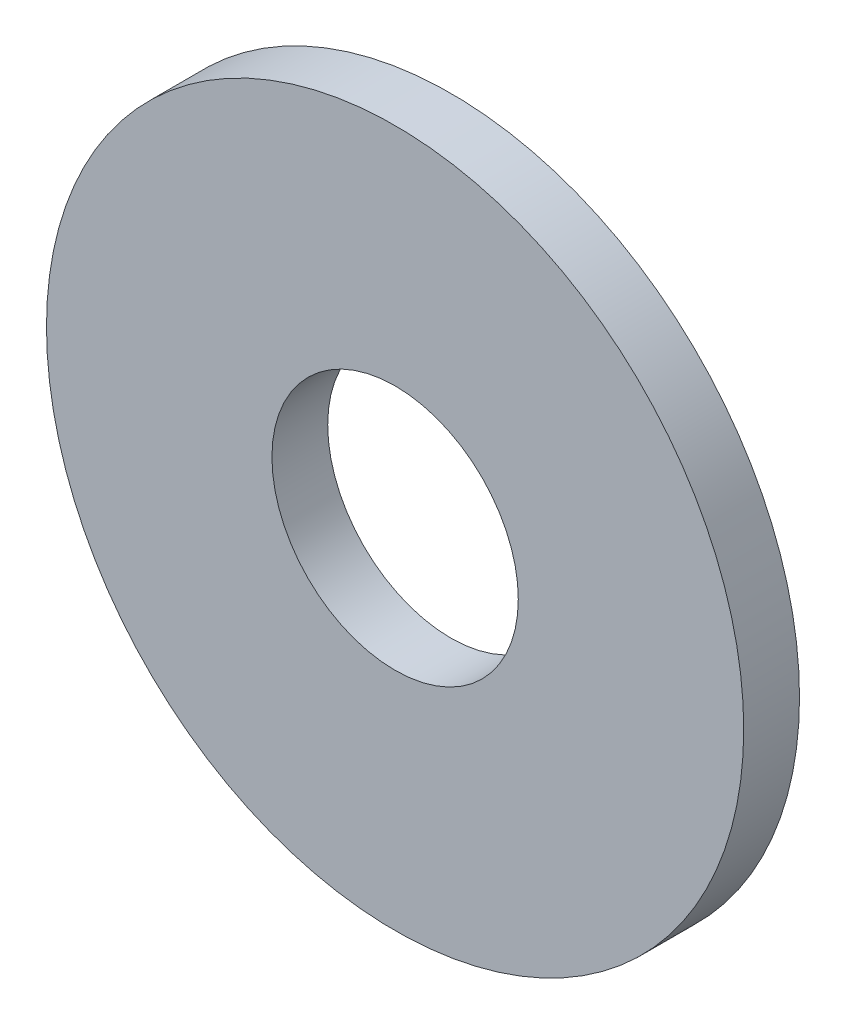
ISO-10303-21;
HEADER;
FILE_DESCRIPTION(('STEP AP214'),'2;1');
FILE_NAME('part.step','',(''),(''),'','','');
FILE_SCHEMA(('AUTOMOTIVE_DESIGN { 1 0 10303 214 1 1 1 1 }'));
ENDSEC;
DATA;
#1=APPLICATION_CONTEXT('core data for automotive mechanical design processes');
#2=APPLICATION_PROTOCOL_DEFINITION('international standard','automotive_design',2000,#1);
#3=PRODUCT_CONTEXT('',#1,'mechanical');
#4=PRODUCT('Part','Part','',(#3));
#5=PRODUCT_RELATED_PRODUCT_CATEGORY('part','',(#4));
#6=PRODUCT_DEFINITION_FORMATION('','',#4);
#7=PRODUCT_DEFINITION_CONTEXT('part definition',#1,'design');
#8=PRODUCT_DEFINITION('design','',#6,#7);
#9=PRODUCT_DEFINITION_SHAPE('','',#8);
#10=(LENGTH_UNIT() NAMED_UNIT(*) SI_UNIT(.MILLI.,.METRE.));
#11=(NAMED_UNIT(*) PLANE_ANGLE_UNIT() SI_UNIT($,.RADIAN.));
#12=(NAMED_UNIT(*) SI_UNIT($,.STERADIAN.) SOLID_ANGLE_UNIT());
#13=UNCERTAINTY_MEASURE_WITH_UNIT(LENGTH_MEASURE(1.E-05),#10,'distance_accuracy_value','');
#14=(GEOMETRIC_REPRESENTATION_CONTEXT(3) GLOBAL_UNCERTAINTY_ASSIGNED_CONTEXT((#13)) GLOBAL_UNIT_ASSIGNED_CONTEXT((#10,
#11,#12)) REPRESENTATION_CONTEXT('',''));
#15=CARTESIAN_POINT('',(0.,0.,0.));
#16=DIRECTION('',(0.,0.,1.));
#17=DIRECTION('',(1.,0.,0.));
#18=AXIS2_PLACEMENT_3D('',#15,#16,#17);
#19=CARTESIAN_POINT('',(0.,0.,1.2));
#20=DIRECTION('',(0.,0.,1.));
#21=DIRECTION('',(1.,0.,0.));
#22=AXIS2_PLACEMENT_3D('',#19,#20,#21);
#23=PLANE('',#22);
#24=CARTESIAN_POINT('',(0.,0.,1.2));
#25=DIRECTION('',(0.,0.,1.));
#26=DIRECTION('',(1.,0.,0.));
#27=AXIS2_PLACEMENT_3D('',#24,#25,#26);
#28=CIRCLE('',#27,7.5);
#29=CARTESIAN_POINT('',(7.5,0.,1.2));
#30=VERTEX_POINT('',#29);
#31=EDGE_CURVE('E10',#30,#30,#28,.T.);
#32=ORIENTED_EDGE('',*,*,#31,.T.);
#33=EDGE_LOOP('',(#32));
#34=FACE_BOUND('',#33,.T.);
#35=CARTESIAN_POINT('',(0.,0.,1.2));
#36=DIRECTION('',(0.,0.,1.));
#37=DIRECTION('',(1.,0.,0.));
#38=AXIS2_PLACEMENT_3D('',#35,#36,#37);
#39=CIRCLE('',#38,2.65);
#40=CARTESIAN_POINT('',(2.65,0.,1.2));
#41=VERTEX_POINT('',#40);
#42=EDGE_CURVE('E44',#41,#41,#39,.T.);
#43=ORIENTED_EDGE('',*,*,#42,.F.);
#44=EDGE_LOOP('',(#43));
#45=FACE_BOUND('',#44,.T.);
#46=ADVANCED_FACE('F33',(#34,#45),#23,.T.);
#47=CARTESIAN_POINT('',(0.,0.,0.));
#48=DIRECTION('',(0.,0.,1.));
#49=DIRECTION('',(1.,0.,0.));
#50=AXIS2_PLACEMENT_3D('',#47,#48,#49);
#51=PLANE('',#50);
#52=CARTESIAN_POINT('',(0.,0.,0.));
#53=DIRECTION('',(0.,0.,1.));
#54=DIRECTION('',(1.,0.,0.));
#55=AXIS2_PLACEMENT_3D('',#52,#53,#54);
#56=CIRCLE('',#55,7.5);
#57=CARTESIAN_POINT('',(7.5,0.,0.));
#58=VERTEX_POINT('',#57);
#59=EDGE_CURVE('E37',#58,#58,#56,.T.);
#60=ORIENTED_EDGE('',*,*,#59,.F.);
#61=EDGE_LOOP('',(#60));
#62=FACE_BOUND('',#61,.T.);
#63=CARTESIAN_POINT('',(0.,0.,0.));
#64=DIRECTION('',(0.,0.,1.));
#65=DIRECTION('',(1.,0.,0.));
#66=AXIS2_PLACEMENT_3D('',#63,#64,#65);
#67=CIRCLE('',#66,2.65);
#68=CARTESIAN_POINT('',(2.65,0.,0.));
#69=VERTEX_POINT('',#68);
#70=EDGE_CURVE('E46',#69,#69,#67,.T.);
#71=ORIENTED_EDGE('',*,*,#70,.T.);
#72=EDGE_LOOP('',(#71));
#73=FACE_BOUND('',#72,.T.);
#74=ADVANCED_FACE('F56',(#62,#73),#51,.F.);
#75=CARTESIAN_POINT('',(0.,0.,1.2));
#76=DIRECTION('',(0.,0.,-1.));
#77=DIRECTION('',(-1.,0.,0.));
#78=AXIS2_PLACEMENT_3D('',#75,#76,#77);
#79=CYLINDRICAL_SURFACE('',#78,7.5);
#80=ORIENTED_EDGE('',*,*,#31,.F.);
#81=EDGE_LOOP('',(#80));
#82=FACE_BOUND('',#81,.T.);
#83=ORIENTED_EDGE('',*,*,#59,.T.);
#84=EDGE_LOOP('',(#83));
#85=FACE_BOUND('',#84,.T.);
#86=ADVANCED_FACE('F35',(#82,#85),#79,.T.);
#87=CARTESIAN_POINT('',(0.,0.,1.2));
#88=DIRECTION('',(0.,0.,-1.));
#89=DIRECTION('',(-1.,0.,0.));
#90=AXIS2_PLACEMENT_3D('',#87,#88,#89);
#91=CYLINDRICAL_SURFACE('',#90,2.65);
#92=ORIENTED_EDGE('',*,*,#42,.T.);
#93=EDGE_LOOP('',(#92));
#94=FACE_BOUND('',#93,.T.);
#95=ORIENTED_EDGE('',*,*,#70,.F.);
#96=EDGE_LOOP('',(#95));
#97=FACE_BOUND('',#96,.T.);
#98=ADVANCED_FACE('F52',(#94,#97),#91,.F.);
#99=CLOSED_SHELL('',(#46,#74,#86,#98));
#100=MANIFOLD_SOLID_BREP('B2',#99);
#101=ADVANCED_BREP_SHAPE_REPRESENTATION('',(#18,#100),#14);
#102=SHAPE_DEFINITION_REPRESENTATION(#9,#101);
ENDSEC;
END-ISO-10303-21;
